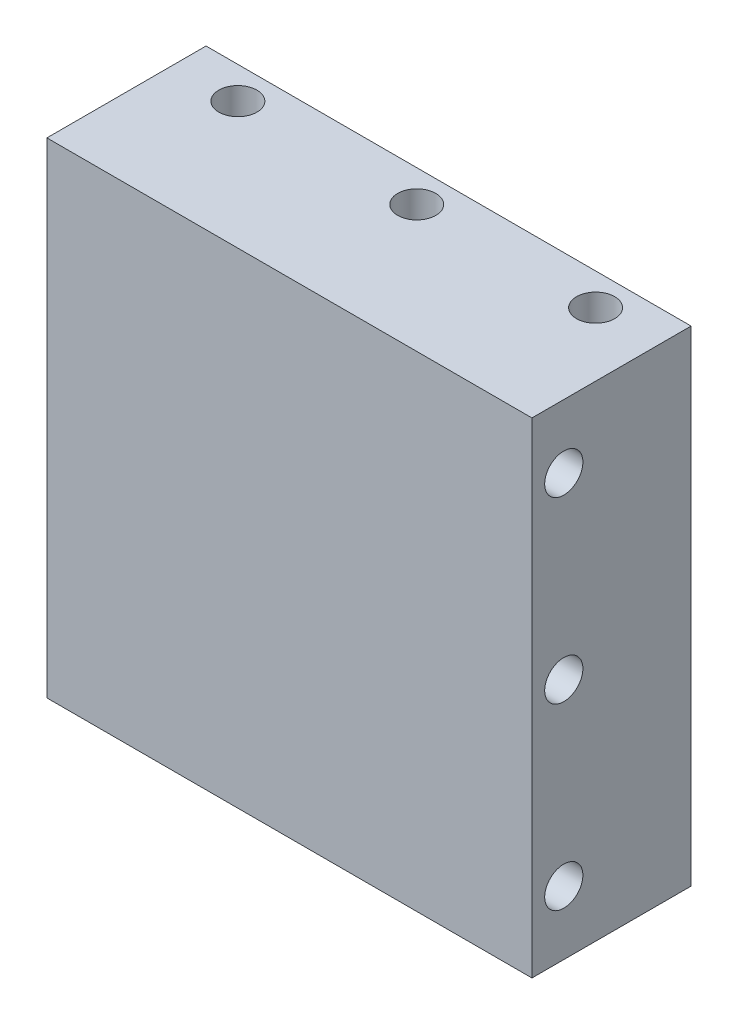
ISO-10303-21;
HEADER;
FILE_DESCRIPTION(('STEP AP214'),'2;1');
FILE_NAME('part.step','',(''),(''),'','','');
FILE_SCHEMA(('AUTOMOTIVE_DESIGN { 1 0 10303 214 1 1 1 1 }'));
ENDSEC;
DATA;
#1=APPLICATION_CONTEXT('core data for automotive mechanical design processes');
#2=APPLICATION_PROTOCOL_DEFINITION('international standard','automotive_design',2000,#1);
#3=PRODUCT_CONTEXT('',#1,'mechanical');
#4=PRODUCT('Part','Part','',(#3));
#5=PRODUCT_RELATED_PRODUCT_CATEGORY('part','',(#4));
#6=PRODUCT_DEFINITION_FORMATION('','',#4);
#7=PRODUCT_DEFINITION_CONTEXT('part definition',#1,'design');
#8=PRODUCT_DEFINITION('design','',#6,#7);
#9=PRODUCT_DEFINITION_SHAPE('','',#8);
#10=(LENGTH_UNIT() NAMED_UNIT(*) SI_UNIT(.MILLI.,.METRE.));
#11=(NAMED_UNIT(*) PLANE_ANGLE_UNIT() SI_UNIT($,.RADIAN.));
#12=(NAMED_UNIT(*) SI_UNIT($,.STERADIAN.) SOLID_ANGLE_UNIT());
#13=UNCERTAINTY_MEASURE_WITH_UNIT(LENGTH_MEASURE(1.E-05),#10,'distance_accuracy_value','');
#14=(GEOMETRIC_REPRESENTATION_CONTEXT(3) GLOBAL_UNCERTAINTY_ASSIGNED_CONTEXT((#13)) GLOBAL_UNIT_ASSIGNED_CONTEXT((#10,
#11,#12)) REPRESENTATION_CONTEXT('',''));
#15=CARTESIAN_POINT('',(0.,0.,0.));
#16=DIRECTION('',(0.,0.,1.));
#17=DIRECTION('',(1.,0.,0.));
#18=AXIS2_PLACEMENT_3D('',#15,#16,#17);
#19=CARTESIAN_POINT('',(76.2,76.2,50.));
#20=DIRECTION('',(-1.,0.,0.));
#21=DIRECTION('',(0.,-1.,0.));
#22=AXIS2_PLACEMENT_3D('',#19,#20,#21);
#23=PLANE('',#22);
#24=CARTESIAN_POINT('',(76.2,56.2,40.));
#25=DIRECTION('',(1.,0.,0.));
#26=DIRECTION('',(0.,1.,0.));
#27=AXIS2_PLACEMENT_3D('',#24,#25,#26);
#28=CIRCLE('',#27,5.99999999999999);
#29=CARTESIAN_POINT('',(76.2,62.2,40.));
#30=VERTEX_POINT('',#29);
#31=EDGE_CURVE('E145',#30,#30,#28,.T.);
#32=ORIENTED_EDGE('',*,*,#31,.F.);
#33=EDGE_LOOP('',(#32));
#34=FACE_BOUND('',#33,.T.);
#35=CARTESIAN_POINT('',(76.2,0.,40.));
#36=DIRECTION('',(1.,0.,0.));
#37=DIRECTION('',(0.,1.,0.));
#38=AXIS2_PLACEMENT_3D('',#35,#36,#37);
#39=CIRCLE('',#38,5.99999999999999);
#40=CARTESIAN_POINT('',(76.2,6.00000000000002,40.));
#41=VERTEX_POINT('',#40);
#42=EDGE_CURVE('E137',#41,#41,#39,.T.);
#43=ORIENTED_EDGE('',*,*,#42,.F.);
#44=EDGE_LOOP('',(#43));
#45=FACE_BOUND('',#44,.T.);
#46=CARTESIAN_POINT('',(76.2,-56.2,40.));
#47=DIRECTION('',(1.,0.,0.));
#48=DIRECTION('',(0.,1.,0.));
#49=AXIS2_PLACEMENT_3D('',#46,#47,#48);
#50=CIRCLE('',#49,6.00000000000001);
#51=CARTESIAN_POINT('',(76.2,-50.2,40.));
#52=VERTEX_POINT('',#51);
#53=EDGE_CURVE('E128',#52,#52,#50,.T.);
#54=ORIENTED_EDGE('',*,*,#53,.F.);
#55=EDGE_LOOP('',(#54));
#56=FACE_BOUND('',#55,.T.);
#57=DIRECTION('',(0.,1.,0.));
#58=VECTOR('',#57,1.);
#59=CARTESIAN_POINT('',(76.2,76.2,0.));
#60=LINE('',#59,#58);
#61=CARTESIAN_POINT('',(76.2,-76.2,0.));
#62=VERTEX_POINT('',#61);
#63=CARTESIAN_POINT('',(76.2,76.2,0.));
#64=VERTEX_POINT('',#63);
#65=EDGE_CURVE('E107',#62,#64,#60,.T.);
#66=ORIENTED_EDGE('',*,*,#65,.T.);
#67=DIRECTION('',(0.,0.,-1.));
#68=VECTOR('',#67,1.);
#69=CARTESIAN_POINT('',(76.2,76.2,50.));
#70=LINE('',#69,#68);
#71=CARTESIAN_POINT('',(76.2,76.2,50.));
#72=VERTEX_POINT('',#71);
#73=EDGE_CURVE('E11',#72,#64,#70,.T.);
#74=ORIENTED_EDGE('',*,*,#73,.F.);
#75=DIRECTION('',(0.,1.,0.));
#76=VECTOR('',#75,1.);
#77=CARTESIAN_POINT('',(76.2,76.2,50.));
#78=LINE('',#77,#76);
#79=CARTESIAN_POINT('',(76.2,-76.2,50.));
#80=VERTEX_POINT('',#79);
#81=EDGE_CURVE('E91',#80,#72,#78,.T.);
#82=ORIENTED_EDGE('',*,*,#81,.F.);
#83=DIRECTION('',(0.,0.,-1.));
#84=VECTOR('',#83,1.);
#85=CARTESIAN_POINT('',(76.2,-76.2,50.));
#86=LINE('',#85,#84);
#87=EDGE_CURVE('E103',#80,#62,#86,.T.);
#88=ORIENTED_EDGE('',*,*,#87,.T.);
#89=EDGE_LOOP('',(#66,#74,#82,#88));
#90=FACE_BOUND('',#89,.T.);
#91=ADVANCED_FACE('F39',(#34,#45,#56,#90),#23,.F.);
#92=CARTESIAN_POINT('',(-76.2,76.2,50.));
#93=DIRECTION('',(0.,-1.,0.));
#94=DIRECTION('',(0.,0.,-1.));
#95=AXIS2_PLACEMENT_3D('',#92,#93,#94);
#96=PLANE('',#95);
#97=CARTESIAN_POINT('',(-56.2,76.2,10.));
#98=DIRECTION('',(0.,1.,0.));
#99=DIRECTION('',(0.,0.,1.));
#100=AXIS2_PLACEMENT_3D('',#97,#98,#99);
#101=CIRCLE('',#100,6.);
#102=CARTESIAN_POINT('',(-56.2,76.2,16.));
#103=VERTEX_POINT('',#102);
#104=EDGE_CURVE('E168',#103,#103,#101,.T.);
#105=ORIENTED_EDGE('',*,*,#104,.F.);
#106=EDGE_LOOP('',(#105));
#107=FACE_BOUND('',#106,.T.);
#108=CARTESIAN_POINT('',(0.,76.2,10.));
#109=DIRECTION('',(0.,1.,0.));
#110=DIRECTION('',(0.,0.,1.));
#111=AXIS2_PLACEMENT_3D('',#108,#109,#110);
#112=CIRCLE('',#111,6.);
#113=CARTESIAN_POINT('',(0.,76.2,16.));
#114=VERTEX_POINT('',#113);
#115=EDGE_CURVE('E160',#114,#114,#112,.T.);
#116=ORIENTED_EDGE('',*,*,#115,.F.);
#117=EDGE_LOOP('',(#116));
#118=FACE_BOUND('',#117,.T.);
#119=CARTESIAN_POINT('',(56.2,76.2,10.));
#120=DIRECTION('',(0.,1.,0.));
#121=DIRECTION('',(0.,0.,1.));
#122=AXIS2_PLACEMENT_3D('',#119,#120,#121);
#123=CIRCLE('',#122,6.);
#124=CARTESIAN_POINT('',(56.2,76.2,16.));
#125=VERTEX_POINT('',#124);
#126=EDGE_CURVE('E152',#125,#125,#123,.T.);
#127=ORIENTED_EDGE('',*,*,#126,.F.);
#128=EDGE_LOOP('',(#127));
#129=FACE_BOUND('',#128,.T.);
#130=DIRECTION('',(-1.,0.,0.));
#131=VECTOR('',#130,1.);
#132=CARTESIAN_POINT('',(-76.2,76.2,0.));
#133=LINE('',#132,#131);
#134=CARTESIAN_POINT('',(-76.2,76.2,0.));
#135=VERTEX_POINT('',#134);
#136=EDGE_CURVE('E96',#64,#135,#133,.T.);
#137=ORIENTED_EDGE('',*,*,#136,.T.);
#138=DIRECTION('',(0.,0.,-1.));
#139=VECTOR('',#138,1.);
#140=CARTESIAN_POINT('',(-76.2,76.2,50.));
#141=LINE('',#140,#139);
#142=CARTESIAN_POINT('',(-76.2,76.2,50.));
#143=VERTEX_POINT('',#142);
#144=EDGE_CURVE('E48',#143,#135,#141,.T.);
#145=ORIENTED_EDGE('',*,*,#144,.F.);
#146=DIRECTION('',(-1.,0.,0.));
#147=VECTOR('',#146,1.);
#148=CARTESIAN_POINT('',(-76.2,76.2,50.));
#149=LINE('',#148,#147);
#150=EDGE_CURVE('E86',#72,#143,#149,.T.);
#151=ORIENTED_EDGE('',*,*,#150,.F.);
#152=ORIENTED_EDGE('',*,*,#73,.T.);
#153=EDGE_LOOP('',(#137,#145,#151,#152));
#154=FACE_BOUND('',#153,.T.);
#155=ADVANCED_FACE('F95',(#107,#118,#129,#154),#96,.F.);
#156=CARTESIAN_POINT('',(-76.2,76.2,50.));
#157=DIRECTION('',(1.,0.,0.));
#158=DIRECTION('',(0.,1.,0.));
#159=AXIS2_PLACEMENT_3D('',#156,#157,#158);
#160=PLANE('',#159);
#161=CARTESIAN_POINT('',(-76.2,56.2,40.));
#162=DIRECTION('',(1.,0.,0.));
#163=DIRECTION('',(0.,1.,0.));
#164=AXIS2_PLACEMENT_3D('',#161,#162,#163);
#165=CIRCLE('',#164,5.99999999999999);
#166=CARTESIAN_POINT('',(-76.2,62.2,40.));
#167=VERTEX_POINT('',#166);
#168=EDGE_CURVE('E111',#167,#167,#165,.T.);
#169=ORIENTED_EDGE('',*,*,#168,.T.);
#170=EDGE_LOOP('',(#169));
#171=FACE_BOUND('',#170,.T.);
#172=CARTESIAN_POINT('',(-76.2,0.,40.));
#173=DIRECTION('',(1.,0.,0.));
#174=DIRECTION('',(0.,1.,0.));
#175=AXIS2_PLACEMENT_3D('',#172,#173,#174);
#176=CIRCLE('',#175,5.99999999999999);
#177=CARTESIAN_POINT('',(-76.2,6.,40.));
#178=VERTEX_POINT('',#177);
#179=EDGE_CURVE('E141',#178,#178,#176,.T.);
#180=ORIENTED_EDGE('',*,*,#179,.T.);
#181=EDGE_LOOP('',(#180));
#182=FACE_BOUND('',#181,.T.);
#183=CARTESIAN_POINT('',(-76.2,-56.2,40.));
#184=DIRECTION('',(1.,0.,0.));
#185=DIRECTION('',(0.,1.,0.));
#186=AXIS2_PLACEMENT_3D('',#183,#184,#185);
#187=CIRCLE('',#186,6.00000000000001);
#188=CARTESIAN_POINT('',(-76.2,-50.2,40.));
#189=VERTEX_POINT('',#188);
#190=EDGE_CURVE('E132',#189,#189,#187,.T.);
#191=ORIENTED_EDGE('',*,*,#190,.T.);
#192=EDGE_LOOP('',(#191));
#193=FACE_BOUND('',#192,.T.);
#194=DIRECTION('',(0.,-1.,0.));
#195=VECTOR('',#194,1.);
#196=CARTESIAN_POINT('',(-76.2,76.2,0.));
#197=LINE('',#196,#195);
#198=CARTESIAN_POINT('',(-76.2,-76.2,0.));
#199=VERTEX_POINT('',#198);
#200=EDGE_CURVE('E73',#135,#199,#197,.T.);
#201=ORIENTED_EDGE('',*,*,#200,.T.);
#202=DIRECTION('',(0.,0.,-1.));
#203=VECTOR('',#202,1.);
#204=CARTESIAN_POINT('',(-76.2,-76.2,50.));
#205=LINE('',#204,#203);
#206=CARTESIAN_POINT('',(-76.2,-76.2,50.));
#207=VERTEX_POINT('',#206);
#208=EDGE_CURVE('E98',#207,#199,#205,.T.);
#209=ORIENTED_EDGE('',*,*,#208,.F.);
#210=DIRECTION('',(0.,-1.,0.));
#211=VECTOR('',#210,1.);
#212=CARTESIAN_POINT('',(-76.2,76.2,50.));
#213=LINE('',#212,#211);
#214=EDGE_CURVE('E89',#143,#207,#213,.T.);
#215=ORIENTED_EDGE('',*,*,#214,.F.);
#216=ORIENTED_EDGE('',*,*,#144,.T.);
#217=EDGE_LOOP('',(#201,#209,#215,#216));
#218=FACE_BOUND('',#217,.T.);
#219=ADVANCED_FACE('F99',(#171,#182,#193,#218),#160,.F.);
#220=CARTESIAN_POINT('',(-76.2,-76.2,50.));
#221=DIRECTION('',(0.,1.,0.));
#222=DIRECTION('',(0.,0.,1.));
#223=AXIS2_PLACEMENT_3D('',#220,#221,#222);
#224=PLANE('',#223);
#225=CARTESIAN_POINT('',(-56.2,-76.2,10.));
#226=DIRECTION('',(0.,1.,0.));
#227=DIRECTION('',(0.,0.,1.));
#228=AXIS2_PLACEMENT_3D('',#225,#226,#227);
#229=CIRCLE('',#228,6.);
#230=CARTESIAN_POINT('',(-56.2,-76.2,16.));
#231=VERTEX_POINT('',#230);
#232=EDGE_CURVE('E133',#231,#231,#229,.T.);
#233=ORIENTED_EDGE('',*,*,#232,.T.);
#234=EDGE_LOOP('',(#233));
#235=FACE_BOUND('',#234,.T.);
#236=CARTESIAN_POINT('',(0.,-76.2,10.));
#237=DIRECTION('',(0.,1.,0.));
#238=DIRECTION('',(0.,0.,1.));
#239=AXIS2_PLACEMENT_3D('',#236,#237,#238);
#240=CIRCLE('',#239,6.);
#241=CARTESIAN_POINT('',(0.,-76.2,16.));
#242=VERTEX_POINT('',#241);
#243=EDGE_CURVE('E164',#242,#242,#240,.T.);
#244=ORIENTED_EDGE('',*,*,#243,.T.);
#245=EDGE_LOOP('',(#244));
#246=FACE_BOUND('',#245,.T.);
#247=CARTESIAN_POINT('',(56.2,-76.2,10.));
#248=DIRECTION('',(0.,1.,0.));
#249=DIRECTION('',(0.,0.,1.));
#250=AXIS2_PLACEMENT_3D('',#247,#248,#249);
#251=CIRCLE('',#250,6.);
#252=CARTESIAN_POINT('',(56.2,-76.2,16.));
#253=VERTEX_POINT('',#252);
#254=EDGE_CURVE('E156',#253,#253,#251,.T.);
#255=ORIENTED_EDGE('',*,*,#254,.T.);
#256=EDGE_LOOP('',(#255));
#257=FACE_BOUND('',#256,.T.);
#258=DIRECTION('',(1.,0.,0.));
#259=VECTOR('',#258,1.);
#260=CARTESIAN_POINT('',(-76.2,-76.2,0.));
#261=LINE('',#260,#259);
#262=EDGE_CURVE('E79',#199,#62,#261,.T.);
#263=ORIENTED_EDGE('',*,*,#262,.T.);
#264=ORIENTED_EDGE('',*,*,#87,.F.);
#265=DIRECTION('',(1.,0.,0.));
#266=VECTOR('',#265,1.);
#267=CARTESIAN_POINT('',(-76.2,-76.2,50.));
#268=LINE('',#267,#266);
#269=EDGE_CURVE('E56',#207,#80,#268,.T.);
#270=ORIENTED_EDGE('',*,*,#269,.F.);
#271=ORIENTED_EDGE('',*,*,#208,.T.);
#272=EDGE_LOOP('',(#263,#264,#270,#271));
#273=FACE_BOUND('',#272,.T.);
#274=ADVANCED_FACE('F121',(#235,#246,#257,#273),#224,.F.);
#275=CARTESIAN_POINT('',(0.,0.,50.));
#276=DIRECTION('',(0.,0.,1.));
#277=DIRECTION('',(1.,0.,0.));
#278=AXIS2_PLACEMENT_3D('',#275,#276,#277);
#279=PLANE('',#278);
#280=ORIENTED_EDGE('',*,*,#81,.T.);
#281=ORIENTED_EDGE('',*,*,#150,.T.);
#282=ORIENTED_EDGE('',*,*,#214,.T.);
#283=ORIENTED_EDGE('',*,*,#269,.T.);
#284=EDGE_LOOP('',(#280,#281,#282,#283));
#285=FACE_BOUND('',#284,.T.);
#286=ADVANCED_FACE('F87',(#285),#279,.T.);
#287=CARTESIAN_POINT('',(0.,0.,0.));
#288=DIRECTION('',(0.,0.,1.));
#289=DIRECTION('',(1.,0.,0.));
#290=AXIS2_PLACEMENT_3D('',#287,#288,#289);
#291=PLANE('',#290);
#292=ORIENTED_EDGE('',*,*,#65,.F.);
#293=ORIENTED_EDGE('',*,*,#262,.F.);
#294=ORIENTED_EDGE('',*,*,#200,.F.);
#295=ORIENTED_EDGE('',*,*,#136,.F.);
#296=EDGE_LOOP('',(#292,#293,#294,#295));
#297=FACE_BOUND('',#296,.T.);
#298=ADVANCED_FACE('F124',(#297),#291,.F.);
#299=CARTESIAN_POINT('',(-76.2,-56.2,40.));
#300=DIRECTION('',(1.,0.,0.));
#301=DIRECTION('',(0.,1.,0.));
#302=AXIS2_PLACEMENT_3D('',#299,#300,#301);
#303=CYLINDRICAL_SURFACE('',#302,6.00000000000001);
#304=ORIENTED_EDGE('',*,*,#190,.F.);
#305=EDGE_LOOP('',(#304));
#306=FACE_BOUND('',#305,.T.);
#307=ORIENTED_EDGE('',*,*,#53,.T.);
#308=EDGE_LOOP('',(#307));
#309=FACE_BOUND('',#308,.T.);
#310=ADVANCED_FACE('F216',(#306,#309),#303,.F.);
#311=CARTESIAN_POINT('',(-76.2,0.,40.));
#312=DIRECTION('',(1.,0.,0.));
#313=DIRECTION('',(0.,1.,0.));
#314=AXIS2_PLACEMENT_3D('',#311,#312,#313);
#315=CYLINDRICAL_SURFACE('',#314,5.99999999999999);
#316=ORIENTED_EDGE('',*,*,#179,.F.);
#317=EDGE_LOOP('',(#316));
#318=FACE_BOUND('',#317,.T.);
#319=ORIENTED_EDGE('',*,*,#42,.T.);
#320=EDGE_LOOP('',(#319));
#321=FACE_BOUND('',#320,.T.);
#322=ADVANCED_FACE('F202',(#318,#321),#315,.F.);
#323=CARTESIAN_POINT('',(-76.2,56.2,40.));
#324=DIRECTION('',(1.,0.,0.));
#325=DIRECTION('',(0.,1.,0.));
#326=AXIS2_PLACEMENT_3D('',#323,#324,#325);
#327=CYLINDRICAL_SURFACE('',#326,5.99999999999999);
#328=ORIENTED_EDGE('',*,*,#168,.F.);
#329=EDGE_LOOP('',(#328));
#330=FACE_BOUND('',#329,.T.);
#331=ORIENTED_EDGE('',*,*,#31,.T.);
#332=EDGE_LOOP('',(#331));
#333=FACE_BOUND('',#332,.T.);
#334=ADVANCED_FACE('F193',(#330,#333),#327,.F.);
#335=CARTESIAN_POINT('',(56.2,-76.2,10.));
#336=DIRECTION('',(0.,1.,0.));
#337=DIRECTION('',(0.,0.,1.));
#338=AXIS2_PLACEMENT_3D('',#335,#336,#337);
#339=CYLINDRICAL_SURFACE('',#338,6.);
#340=CARTESIAN_POINT('',(56.2,-76.2,16.));
#341=CARTESIAN_POINT('',(56.2,-74.6125,16.));
#342=CARTESIAN_POINT('',(56.2,-73.025,16.));
#343=CARTESIAN_POINT('',(56.2,-69.85,16.));
#344=CARTESIAN_POINT('',(56.2,-68.2625,16.));
#345=CARTESIAN_POINT('',(56.2,-65.0875,16.));
#346=CARTESIAN_POINT('',(56.2,-63.5,16.));
#347=CARTESIAN_POINT('',(56.2,-60.325,16.));
#348=CARTESIAN_POINT('',(56.2,-58.7375,16.));
#349=CARTESIAN_POINT('',(56.2,-55.5625,16.));
#350=CARTESIAN_POINT('',(56.2,-53.975,16.));
#351=CARTESIAN_POINT('',(56.2,-50.8,16.));
#352=CARTESIAN_POINT('',(56.2,-49.2125,16.));
#353=CARTESIAN_POINT('',(56.2,-46.0375,16.));
#354=CARTESIAN_POINT('',(56.2,-44.45,16.));
#355=CARTESIAN_POINT('',(56.2,-41.275,16.));
#356=CARTESIAN_POINT('',(56.2,-39.6875,16.));
#357=CARTESIAN_POINT('',(56.2,-36.5125,16.));
#358=CARTESIAN_POINT('',(56.2,-34.925,16.));
#359=CARTESIAN_POINT('',(56.2,-31.75,16.));
#360=CARTESIAN_POINT('',(56.2,-30.1625,16.));
#361=CARTESIAN_POINT('',(56.2,-26.9875,16.));
#362=CARTESIAN_POINT('',(56.2,-25.4,16.));
#363=CARTESIAN_POINT('',(56.2,-22.225,16.));
#364=CARTESIAN_POINT('',(56.2,-20.6375,16.));
#365=CARTESIAN_POINT('',(56.2,-17.4625,16.));
#366=CARTESIAN_POINT('',(56.2,-15.875,16.));
#367=CARTESIAN_POINT('',(56.2,-12.7,16.));
#368=CARTESIAN_POINT('',(56.2,-11.1125,16.));
#369=CARTESIAN_POINT('',(56.2,-7.93749999999999,16.));
#370=CARTESIAN_POINT('',(56.2,-6.34999999999999,16.));
#371=CARTESIAN_POINT('',(56.2,-3.17499999999999,16.));
#372=CARTESIAN_POINT('',(56.2,-1.58749999999999,16.));
#373=CARTESIAN_POINT('',(56.2,1.58750000000001,16.));
#374=CARTESIAN_POINT('',(56.2,3.17500000000002,16.));
#375=CARTESIAN_POINT('',(56.2,6.35000000000002,16.));
#376=CARTESIAN_POINT('',(56.2,7.93750000000002,16.));
#377=CARTESIAN_POINT('',(56.2,11.1125,16.));
#378=CARTESIAN_POINT('',(56.2,12.7,16.));
#379=CARTESIAN_POINT('',(56.2,15.875,16.));
#380=CARTESIAN_POINT('',(56.2,17.4625,16.));
#381=CARTESIAN_POINT('',(56.2,20.6375,16.));
#382=CARTESIAN_POINT('',(56.2,22.225,16.));
#383=CARTESIAN_POINT('',(56.2,25.4,16.));
#384=CARTESIAN_POINT('',(56.2,26.9875,16.));
#385=CARTESIAN_POINT('',(56.2,30.1625,16.));
#386=CARTESIAN_POINT('',(56.2,31.75,16.));
#387=CARTESIAN_POINT('',(56.2,34.925,16.));
#388=CARTESIAN_POINT('',(56.2,36.5125,16.));
#389=CARTESIAN_POINT('',(56.2,39.6875,16.));
#390=CARTESIAN_POINT('',(56.2,41.275,16.));
#391=CARTESIAN_POINT('',(56.2,44.45,16.));
#392=CARTESIAN_POINT('',(56.2,46.0375,16.));
#393=CARTESIAN_POINT('',(56.2,49.2125,16.));
#394=CARTESIAN_POINT('',(56.2,50.8,16.));
#395=CARTESIAN_POINT('',(56.2,53.975,16.));
#396=CARTESIAN_POINT('',(56.2,55.5625,16.));
#397=CARTESIAN_POINT('',(56.2,58.7375,16.));
#398=CARTESIAN_POINT('',(56.2,60.325,16.));
#399=CARTESIAN_POINT('',(56.2,63.5,16.));
#400=CARTESIAN_POINT('',(56.2,65.0875,16.));
#401=CARTESIAN_POINT('',(56.2,68.2625,16.));
#402=CARTESIAN_POINT('',(56.2,69.85,16.));
#403=CARTESIAN_POINT('',(56.2,73.025,16.));
#404=CARTESIAN_POINT('',(56.2,74.6125,16.));
#405=CARTESIAN_POINT('',(56.2,76.2,16.));
#406=B_SPLINE_CURVE_WITH_KNOTS('',3,(#340,#341,#342,#343,#344,#345,#346,#347,#348,#349,#350,
#351,#352,#353,#354,#355,#356,#357,#358,#359,#360,#361,#362,#363,#364,#365,#366,#367,#368,#369,
#370,#371,#372,#373,#374,#375,#376,#377,#378,#379,#380,#381,#382,#383,#384,#385,#386,#387,#388,
#389,#390,#391,#392,#393,#394,#395,#396,#397,#398,#399,#400,#401,#402,#403,#404,#405),
.UNSPECIFIED.,.F.,.F.,(4,2,2,2,2,2,2,2,2,2,2,2,2,2,2,2,2,2,2,2,2,2,2,2,2,2,2,2,2,2,2,2,4),(0.,
4.7625,9.52500000000001,14.2875,19.05,23.8125,28.575,33.3375,38.1,42.8625,47.625,52.3875,57.15,
61.9125,66.675,71.4375,76.2,80.9625,85.725,90.4875,95.25,100.0125,104.775,109.5375,114.3,
119.0625,123.825,128.5875,133.35,138.1125,142.875,147.6375,152.4),.UNSPECIFIED.);
#407=EDGE_CURVE('BSEAM191',#253,#125,#406,.T.);
#408=ORIENTED_EDGE('',*,*,#254,.F.);
#409=ORIENTED_EDGE('',*,*,#126,.T.);
#410=ORIENTED_EDGE('',*,*,#407,.T.);
#411=ORIENTED_EDGE('',*,*,#407,.F.);
#412=EDGE_LOOP('',(#408,#410,#409,#411));
#413=FACE_BOUND('',#412,.T.);
#414=ADVANCED_FACE('F191',(#413),#339,.F.);
#415=CARTESIAN_POINT('',(0.,-76.2,10.));
#416=DIRECTION('',(0.,1.,0.));
#417=DIRECTION('',(0.,0.,1.));
#418=AXIS2_PLACEMENT_3D('',#415,#416,#417);
#419=CYLINDRICAL_SURFACE('',#418,6.);
#420=CARTESIAN_POINT('',(0.,-76.2,16.));
#421=CARTESIAN_POINT('',(0.,-74.6125,16.));
#422=CARTESIAN_POINT('',(0.,-73.025,16.));
#423=CARTESIAN_POINT('',(0.,-69.85,16.));
#424=CARTESIAN_POINT('',(0.,-68.2625,16.));
#425=CARTESIAN_POINT('',(0.,-65.0875,16.));
#426=CARTESIAN_POINT('',(0.,-63.5,16.));
#427=CARTESIAN_POINT('',(0.,-60.325,16.));
#428=CARTESIAN_POINT('',(0.,-58.7375,16.));
#429=CARTESIAN_POINT('',(0.,-55.5625,16.));
#430=CARTESIAN_POINT('',(0.,-53.975,16.));
#431=CARTESIAN_POINT('',(0.,-50.8,16.));
#432=CARTESIAN_POINT('',(0.,-49.2125,16.));
#433=CARTESIAN_POINT('',(0.,-46.0375,16.));
#434=CARTESIAN_POINT('',(0.,-44.45,16.));
#435=CARTESIAN_POINT('',(0.,-41.275,16.));
#436=CARTESIAN_POINT('',(0.,-39.6875,16.));
#437=CARTESIAN_POINT('',(0.,-36.5125,16.));
#438=CARTESIAN_POINT('',(0.,-34.925,16.));
#439=CARTESIAN_POINT('',(0.,-31.75,16.));
#440=CARTESIAN_POINT('',(0.,-30.1625,16.));
#441=CARTESIAN_POINT('',(0.,-26.9875,16.));
#442=CARTESIAN_POINT('',(0.,-25.4,16.));
#443=CARTESIAN_POINT('',(0.,-22.225,16.));
#444=CARTESIAN_POINT('',(0.,-20.6375,16.));
#445=CARTESIAN_POINT('',(0.,-17.4625,16.));
#446=CARTESIAN_POINT('',(0.,-15.875,16.));
#447=CARTESIAN_POINT('',(0.,-12.7,16.));
#448=CARTESIAN_POINT('',(0.,-11.1125,16.));
#449=CARTESIAN_POINT('',(0.,-7.93749999999999,16.));
#450=CARTESIAN_POINT('',(0.,-6.34999999999999,16.));
#451=CARTESIAN_POINT('',(0.,-3.17499999999999,16.));
#452=CARTESIAN_POINT('',(0.,-1.58749999999999,16.));
#453=CARTESIAN_POINT('',(0.,1.58750000000001,16.));
#454=CARTESIAN_POINT('',(0.,3.17500000000002,16.));
#455=CARTESIAN_POINT('',(0.,6.35000000000002,16.));
#456=CARTESIAN_POINT('',(0.,7.93750000000002,16.));
#457=CARTESIAN_POINT('',(0.,11.1125,16.));
#458=CARTESIAN_POINT('',(0.,12.7,16.));
#459=CARTESIAN_POINT('',(0.,15.875,16.));
#460=CARTESIAN_POINT('',(0.,17.4625,16.));
#461=CARTESIAN_POINT('',(0.,20.6375,16.));
#462=CARTESIAN_POINT('',(0.,22.225,16.));
#463=CARTESIAN_POINT('',(0.,25.4,16.));
#464=CARTESIAN_POINT('',(0.,26.9875,16.));
#465=CARTESIAN_POINT('',(0.,30.1625,16.));
#466=CARTESIAN_POINT('',(0.,31.75,16.));
#467=CARTESIAN_POINT('',(0.,34.925,16.));
#468=CARTESIAN_POINT('',(0.,36.5125,16.));
#469=CARTESIAN_POINT('',(0.,39.6875,16.));
#470=CARTESIAN_POINT('',(0.,41.275,16.));
#471=CARTESIAN_POINT('',(0.,44.45,16.));
#472=CARTESIAN_POINT('',(0.,46.0375,16.));
#473=CARTESIAN_POINT('',(0.,49.2125,16.));
#474=CARTESIAN_POINT('',(0.,50.8,16.));
#475=CARTESIAN_POINT('',(0.,53.975,16.));
#476=CARTESIAN_POINT('',(0.,55.5625,16.));
#477=CARTESIAN_POINT('',(0.,58.7375,16.));
#478=CARTESIAN_POINT('',(0.,60.325,16.));
#479=CARTESIAN_POINT('',(0.,63.5,16.));
#480=CARTESIAN_POINT('',(0.,65.0875,16.));
#481=CARTESIAN_POINT('',(0.,68.2625,16.));
#482=CARTESIAN_POINT('',(0.,69.85,16.));
#483=CARTESIAN_POINT('',(0.,73.025,16.));
#484=CARTESIAN_POINT('',(0.,74.6125,16.));
#485=CARTESIAN_POINT('',(0.,76.2,16.));
#486=B_SPLINE_CURVE_WITH_KNOTS('',3,(#420,#421,#422,#423,#424,#425,#426,#427,#428,#429,#430,
#431,#432,#433,#434,#435,#436,#437,#438,#439,#440,#441,#442,#443,#444,#445,#446,#447,#448,#449,
#450,#451,#452,#453,#454,#455,#456,#457,#458,#459,#460,#461,#462,#463,#464,#465,#466,#467,#468,
#469,#470,#471,#472,#473,#474,#475,#476,#477,#478,#479,#480,#481,#482,#483,#484,#485),
.UNSPECIFIED.,.F.,.F.,(4,2,2,2,2,2,2,2,2,2,2,2,2,2,2,2,2,2,2,2,2,2,2,2,2,2,2,2,2,2,2,2,4),(0.,
4.7625,9.52500000000001,14.2875,19.05,23.8125,28.575,33.3375,38.1,42.8625,47.625,52.3875,57.15,
61.9125,66.675,71.4375,76.2,80.9625,85.725,90.4875,95.25,100.0125,104.775,109.5375,114.3,
119.0625,123.825,128.5875,133.35,138.1125,142.875,147.6375,152.4),.UNSPECIFIED.);
#487=EDGE_CURVE('BSEAM181',#242,#114,#486,.T.);
#488=ORIENTED_EDGE('',*,*,#243,.F.);
#489=ORIENTED_EDGE('',*,*,#115,.T.);
#490=ORIENTED_EDGE('',*,*,#487,.T.);
#491=ORIENTED_EDGE('',*,*,#487,.F.);
#492=EDGE_LOOP('',(#488,#490,#489,#491));
#493=FACE_BOUND('',#492,.T.);
#494=ADVANCED_FACE('F181',(#493),#419,.F.);
#495=CARTESIAN_POINT('',(-56.2,-76.2,10.));
#496=DIRECTION('',(0.,1.,0.));
#497=DIRECTION('',(0.,0.,1.));
#498=AXIS2_PLACEMENT_3D('',#495,#496,#497);
#499=CYLINDRICAL_SURFACE('',#498,6.);
#500=CARTESIAN_POINT('',(-56.2,-76.2,16.));
#501=CARTESIAN_POINT('',(-56.2,-74.6125,16.));
#502=CARTESIAN_POINT('',(-56.2,-73.025,16.));
#503=CARTESIAN_POINT('',(-56.2,-69.85,16.));
#504=CARTESIAN_POINT('',(-56.2,-68.2625,16.));
#505=CARTESIAN_POINT('',(-56.2,-65.0875,16.));
#506=CARTESIAN_POINT('',(-56.2,-63.5,16.));
#507=CARTESIAN_POINT('',(-56.2,-60.325,16.));
#508=CARTESIAN_POINT('',(-56.2,-58.7375,16.));
#509=CARTESIAN_POINT('',(-56.2,-55.5625,16.));
#510=CARTESIAN_POINT('',(-56.2,-53.975,16.));
#511=CARTESIAN_POINT('',(-56.2,-50.8,16.));
#512=CARTESIAN_POINT('',(-56.2,-49.2125,16.));
#513=CARTESIAN_POINT('',(-56.2,-46.0375,16.));
#514=CARTESIAN_POINT('',(-56.2,-44.45,16.));
#515=CARTESIAN_POINT('',(-56.2,-41.275,16.));
#516=CARTESIAN_POINT('',(-56.2,-39.6875,16.));
#517=CARTESIAN_POINT('',(-56.2,-36.5125,16.));
#518=CARTESIAN_POINT('',(-56.2,-34.925,16.));
#519=CARTESIAN_POINT('',(-56.2,-31.75,16.));
#520=CARTESIAN_POINT('',(-56.2,-30.1625,16.));
#521=CARTESIAN_POINT('',(-56.2,-26.9875,16.));
#522=CARTESIAN_POINT('',(-56.2,-25.4,16.));
#523=CARTESIAN_POINT('',(-56.2,-22.225,16.));
#524=CARTESIAN_POINT('',(-56.2,-20.6375,16.));
#525=CARTESIAN_POINT('',(-56.2,-17.4625,16.));
#526=CARTESIAN_POINT('',(-56.2,-15.875,16.));
#527=CARTESIAN_POINT('',(-56.2,-12.7,16.));
#528=CARTESIAN_POINT('',(-56.2,-11.1125,16.));
#529=CARTESIAN_POINT('',(-56.2,-7.93749999999999,16.));
#530=CARTESIAN_POINT('',(-56.2,-6.34999999999999,16.));
#531=CARTESIAN_POINT('',(-56.2,-3.17499999999999,16.));
#532=CARTESIAN_POINT('',(-56.2,-1.58749999999999,16.));
#533=CARTESIAN_POINT('',(-56.2,1.58750000000001,16.));
#534=CARTESIAN_POINT('',(-56.2,3.17500000000002,16.));
#535=CARTESIAN_POINT('',(-56.2,6.35000000000002,16.));
#536=CARTESIAN_POINT('',(-56.2,7.93750000000002,16.));
#537=CARTESIAN_POINT('',(-56.2,11.1125,16.));
#538=CARTESIAN_POINT('',(-56.2,12.7,16.));
#539=CARTESIAN_POINT('',(-56.2,15.875,16.));
#540=CARTESIAN_POINT('',(-56.2,17.4625,16.));
#541=CARTESIAN_POINT('',(-56.2,20.6375,16.));
#542=CARTESIAN_POINT('',(-56.2,22.225,16.));
#543=CARTESIAN_POINT('',(-56.2,25.4,16.));
#544=CARTESIAN_POINT('',(-56.2,26.9875,16.));
#545=CARTESIAN_POINT('',(-56.2,30.1625,16.));
#546=CARTESIAN_POINT('',(-56.2,31.75,16.));
#547=CARTESIAN_POINT('',(-56.2,34.925,16.));
#548=CARTESIAN_POINT('',(-56.2,36.5125,16.));
#549=CARTESIAN_POINT('',(-56.2,39.6875,16.));
#550=CARTESIAN_POINT('',(-56.2,41.275,16.));
#551=CARTESIAN_POINT('',(-56.2,44.45,16.));
#552=CARTESIAN_POINT('',(-56.2,46.0375,16.));
#553=CARTESIAN_POINT('',(-56.2,49.2125,16.));
#554=CARTESIAN_POINT('',(-56.2,50.8,16.));
#555=CARTESIAN_POINT('',(-56.2,53.975,16.));
#556=CARTESIAN_POINT('',(-56.2,55.5625,16.));
#557=CARTESIAN_POINT('',(-56.2,58.7375,16.));
#558=CARTESIAN_POINT('',(-56.2,60.325,16.));
#559=CARTESIAN_POINT('',(-56.2,63.5,16.));
#560=CARTESIAN_POINT('',(-56.2,65.0875,16.));
#561=CARTESIAN_POINT('',(-56.2,68.2625,16.));
#562=CARTESIAN_POINT('',(-56.2,69.85,16.));
#563=CARTESIAN_POINT('',(-56.2,73.025,16.));
#564=CARTESIAN_POINT('',(-56.2,74.6125,16.));
#565=CARTESIAN_POINT('',(-56.2,76.2,16.));
#566=B_SPLINE_CURVE_WITH_KNOTS('',3,(#500,#501,#502,#503,#504,#505,#506,#507,#508,#509,#510,
#511,#512,#513,#514,#515,#516,#517,#518,#519,#520,#521,#522,#523,#524,#525,#526,#527,#528,#529,
#530,#531,#532,#533,#534,#535,#536,#537,#538,#539,#540,#541,#542,#543,#544,#545,#546,#547,#548,
#549,#550,#551,#552,#553,#554,#555,#556,#557,#558,#559,#560,#561,#562,#563,#564,#565),
.UNSPECIFIED.,.F.,.F.,(4,2,2,2,2,2,2,2,2,2,2,2,2,2,2,2,2,2,2,2,2,2,2,2,2,2,2,2,2,2,2,2,4),(0.,
4.7625,9.52500000000001,14.2875,19.05,23.8125,28.575,33.3375,38.1,42.8625,47.625,52.3875,57.15,
61.9125,66.675,71.4375,76.2,80.9625,85.725,90.4875,95.25,100.0125,104.775,109.5375,114.3,
119.0625,123.825,128.5875,133.35,138.1125,142.875,147.6375,152.4),.UNSPECIFIED.);
#567=EDGE_CURVE('BSEAM178',#231,#103,#566,.T.);
#568=ORIENTED_EDGE('',*,*,#232,.F.);
#569=ORIENTED_EDGE('',*,*,#104,.T.);
#570=ORIENTED_EDGE('',*,*,#567,.T.);
#571=ORIENTED_EDGE('',*,*,#567,.F.);
#572=EDGE_LOOP('',(#568,#570,#569,#571));
#573=FACE_BOUND('',#572,.T.);
#574=ADVANCED_FACE('F178',(#573),#499,.F.);
#575=CLOSED_SHELL('',(#91,#155,#219,#274,#286,#298,#310,#322,#334,#414,#494,#574));
#576=MANIFOLD_SOLID_BREP('B2',#575);
#577=ADVANCED_BREP_SHAPE_REPRESENTATION('',(#18,#576),#14);
#578=SHAPE_DEFINITION_REPRESENTATION(#9,#577);
ENDSEC;
END-ISO-10303-21;
